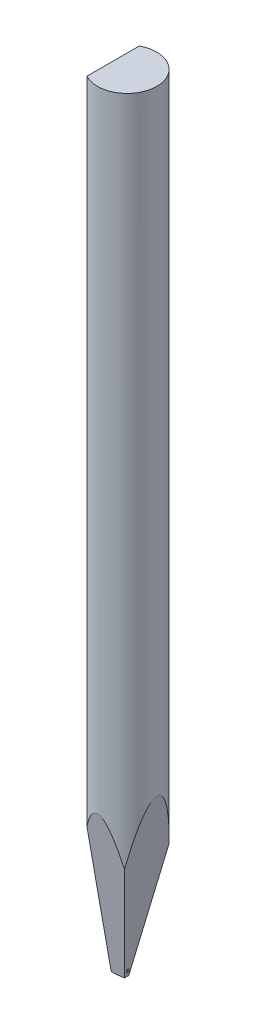
ISO-10303-21;
HEADER;
FILE_DESCRIPTION(('STEP AP214'),'2;1');
FILE_NAME('part.step','',(''),(''),'','','');
FILE_SCHEMA(('AUTOMOTIVE_DESIGN { 1 0 10303 214 1 1 1 1 }'));
ENDSEC;
DATA;
#1=APPLICATION_CONTEXT('core data for automotive mechanical design processes');
#2=APPLICATION_PROTOCOL_DEFINITION('international standard','automotive_design',2000,#1);
#3=PRODUCT_CONTEXT('',#1,'mechanical');
#4=PRODUCT('Part','Part','',(#3));
#5=PRODUCT_RELATED_PRODUCT_CATEGORY('part','',(#4));
#6=PRODUCT_DEFINITION_FORMATION('','',#4);
#7=PRODUCT_DEFINITION_CONTEXT('part definition',#1,'design');
#8=PRODUCT_DEFINITION('design','',#6,#7);
#9=PRODUCT_DEFINITION_SHAPE('','',#8);
#10=(LENGTH_UNIT() NAMED_UNIT(*) SI_UNIT(.MILLI.,.METRE.));
#11=(NAMED_UNIT(*) PLANE_ANGLE_UNIT() SI_UNIT($,.RADIAN.));
#12=(NAMED_UNIT(*) SI_UNIT($,.STERADIAN.) SOLID_ANGLE_UNIT());
#13=UNCERTAINTY_MEASURE_WITH_UNIT(LENGTH_MEASURE(1.E-05),#10,'distance_accuracy_value','');
#14=(GEOMETRIC_REPRESENTATION_CONTEXT(3) GLOBAL_UNCERTAINTY_ASSIGNED_CONTEXT((#13)) GLOBAL_UNIT_ASSIGNED_CONTEXT((#10,
#11,#12)) REPRESENTATION_CONTEXT('',''));
#15=CARTESIAN_POINT('',(0.,0.,0.));
#16=DIRECTION('',(0.,0.,1.));
#17=DIRECTION('',(1.,0.,0.));
#18=AXIS2_PLACEMENT_3D('',#15,#16,#17);
#19=CARTESIAN_POINT('',(26.8738719491216,0.,0.0508));
#20=DIRECTION('',(0.,-0.173648177666931,0.984807753012208));
#21=DIRECTION('',(0.,-0.984807753012208,-0.173648177666931));
#22=AXIS2_PLACEMENT_3D('',#19,#20,#21);
#23=PLANE('',#22);
#24=CARTESIAN_POINT('',(-0.35052,0.0254,0.0552787053099968));
#25=DIRECTION('',(0.,-0.173648177666931,0.984807753012208));
#26=DIRECTION('',(0.,-0.984807753012208,-0.173648177666931));
#27=AXIS2_PLACEMENT_3D('',#24,#25,#26);
#28=ELLIPSE('',#27,0.0257918359418979,0.0254);
#29=CARTESIAN_POINT('',(-0.35052,0.,0.0508000000000018));
#30=VERTEX_POINT('',#29);
#31=CARTESIAN_POINT('',(-0.37592,0.0254,0.0552787053099968));
#32=VERTEX_POINT('',#31);
#33=EDGE_CURVE('E204',#30,#32,#28,.F.);
#34=ORIENTED_EDGE('',*,*,#33,.F.);
#35=DIRECTION('',(-1.,0.,0.));
#36=VECTOR('',#35,1.);
#37=CARTESIAN_POINT('',(26.8738719491216,0.,0.0508));
#38=LINE('',#37,#36);
#39=CARTESIAN_POINT('',(-0.261619999999994,0.,0.0508000000000001));
#40=VERTEX_POINT('',#39);
#41=EDGE_CURVE('E268',#40,#30,#38,.T.);
#42=ORIENTED_EDGE('',*,*,#41,.F.);
#43=DIRECTION('',(-0.98997002855162,-0.139131214142995,-0.0245325869121374));
#44=VECTOR('',#43,1.);
#45=CARTESIAN_POINT('',(26.332265369517,3.73752684781165,0.709826824391458));
#46=LINE('',#45,#44);
#47=CARTESIAN_POINT('',(-0.0141883616704936,0.0347742489826101,0.0569316383295083));
#48=VERTEX_POINT('',#47);
#49=EDGE_CURVE('E265',#48,#40,#46,.T.);
#50=ORIENTED_EDGE('',*,*,#49,.F.);
#51=DIRECTION('',(-0.171087869746036,-0.970287525247814,-0.171087869746036));
#52=VECTOR('',#51,1.);
#53=CARTESIAN_POINT('',(0.766901483986011,4.46455489014234,0.838021483986016));
#54=LINE('',#53,#52);
#55=CARTESIAN_POINT('',(0.523678555180163,3.08516911589156,0.594798555180167));
#56=VERTEX_POINT('',#55);
#57=EDGE_CURVE('E262',#56,#48,#54,.T.);
#58=ORIENTED_EDGE('',*,*,#57,.F.);
#59=CARTESIAN_POINT('',(0.,-0.288101116436578,0.));
#60=DIRECTION('',(0.,-0.173648177666931,0.984807753012208));
#61=DIRECTION('',(0.,-0.984807753012208,-0.173648177666931));
#62=AXIS2_PLACEMENT_3D('',#59,#60,#61);
#63=ELLIPSE('',#62,4.56371043248163,0.792479999999998);
#64=CARTESIAN_POINT('',(-0.37592,3.66844093071415,0.69764511322018));
#65=VERTEX_POINT('',#64);
#66=EDGE_CURVE('E273',#56,#65,#63,.T.);
#67=ORIENTED_EDGE('',*,*,#66,.T.);
#68=DIRECTION('',(0.,0.984807753012208,0.173648177666931));
#69=VECTOR('',#68,1.);
#70=CARTESIAN_POINT('',(-0.37592,20.251112252608,3.62161747949059));
#71=LINE('',#70,#69);
#72=EDGE_CURVE('E287',#32,#65,#71,.T.);
#73=ORIENTED_EDGE('',*,*,#72,.F.);
#74=EDGE_LOOP('',(#34,#42,#50,#58,#67,#73));
#75=FACE_BOUND('',#74,.T.);
#76=ADVANCED_FACE('F46',(#75),#23,.T.);
#77=CARTESIAN_POINT('',(26.8738719491216,0.,-0.0508));
#78=DIRECTION('',(0.,-0.173648177666931,-0.984807753012208));
#79=DIRECTION('',(0.,0.984807753012208,-0.173648177666931));
#80=AXIS2_PLACEMENT_3D('',#77,#78,#79);
#81=PLANE('',#80);
#82=CARTESIAN_POINT('',(-0.35052,0.0254,-0.0552787053099968));
#83=DIRECTION('',(0.,-0.173648177666931,-0.984807753012208));
#84=DIRECTION('',(0.,0.984807753012208,-0.173648177666931));
#85=AXIS2_PLACEMENT_3D('',#82,#83,#84);
#86=ELLIPSE('',#85,0.0257918359418979,0.0254);
#87=CARTESIAN_POINT('',(-0.37592,0.0254,-0.0552787053099968));
#88=VERTEX_POINT('',#87);
#89=CARTESIAN_POINT('',(-0.35052,0.,-0.0508000000000018));
#90=VERTEX_POINT('',#89);
#91=EDGE_CURVE('E201',#88,#90,#86,.F.);
#92=ORIENTED_EDGE('',*,*,#91,.F.);
#93=DIRECTION('',(0.,-0.984807753012208,0.173648177666931));
#94=VECTOR('',#93,1.);
#95=CARTESIAN_POINT('',(-0.37592,20.5255765703836,-3.67001294395617));
#96=LINE('',#95,#94);
#97=CARTESIAN_POINT('',(-0.37592,3.66844093071414,-0.69764511322018));
#98=VERTEX_POINT('',#97);
#99=EDGE_CURVE('E193',#98,#88,#96,.T.);
#100=ORIENTED_EDGE('',*,*,#99,.F.);
#101=CARTESIAN_POINT('',(0.,-0.288101116436578,0.));
#102=DIRECTION('',(0.,-0.173648177666931,-0.984807753012208));
#103=DIRECTION('',(0.,-0.984807753012208,0.173648177666931));
#104=AXIS2_PLACEMENT_3D('',#101,#102,#103);
#105=ELLIPSE('',#104,4.56371043248163,0.792479999999998);
#106=CARTESIAN_POINT('',(0.523678555180163,3.08516911589156,-0.594798555180167));
#107=VERTEX_POINT('',#106);
#108=EDGE_CURVE('E276',#98,#107,#105,.T.);
#109=ORIENTED_EDGE('',*,*,#108,.T.);
#110=DIRECTION('',(0.171087869746036,0.970287525247814,-0.171087869746036));
#111=VECTOR('',#110,1.);
#112=CARTESIAN_POINT('',(0.766901483986011,4.46455489014234,-0.838021483986016));
#113=LINE('',#112,#111);
#114=CARTESIAN_POINT('',(-0.0141883616704936,0.0347742489826101,-0.0569316383295083));
#115=VERTEX_POINT('',#114);
#116=EDGE_CURVE('E290',#115,#107,#113,.T.);
#117=ORIENTED_EDGE('',*,*,#116,.F.);
#118=DIRECTION('',(0.98997002855162,0.139131214142995,-0.0245325869121374));
#119=VECTOR('',#118,1.);
#120=CARTESIAN_POINT('',(26.332265369517,3.73752684781165,-0.709826824391458));
#121=LINE('',#120,#119);
#122=CARTESIAN_POINT('',(-0.261619999999994,0.,-0.0508000000000001));
#123=VERTEX_POINT('',#122);
#124=EDGE_CURVE('E293',#123,#115,#121,.T.);
#125=ORIENTED_EDGE('',*,*,#124,.F.);
#126=DIRECTION('',(-1.,0.,0.));
#127=VECTOR('',#126,1.);
#128=CARTESIAN_POINT('',(26.8738719491216,0.,-0.0508));
#129=LINE('',#128,#127);
#130=EDGE_CURVE('E270',#123,#90,#129,.T.);
#131=ORIENTED_EDGE('',*,*,#130,.T.);
#132=EDGE_LOOP('',(#92,#100,#109,#117,#125,#131));
#133=FACE_BOUND('',#132,.T.);
#134=ADVANCED_FACE('F382',(#133),#81,.T.);
#135=CARTESIAN_POINT('',(-0.26162,0.,27.2760283406468));
#136=DIRECTION('',(-0.139173100960066,0.99026806874157,0.));
#137=DIRECTION('',(-0.99026806874157,-0.139173100960066,0.));
#138=AXIS2_PLACEMENT_3D('',#135,#136,#137);
#139=PLANE('',#138);
#140=DIRECTION('',(-0.99026806874157,-0.139173100960066,0.));
#141=VECTOR('',#140,1.);
#142=CARTESIAN_POINT('',(-0.26162,0.,0.0266699999999995));
#143=LINE('',#142,#141);
#144=CARTESIAN_POINT('',(-0.14478,0.0164207911266275,0.0266699999999997));
#145=VERTEX_POINT('',#144);
#146=CARTESIAN_POINT('',(-0.242759688637711,0.00265064390160265,0.02667));
#147=VERTEX_POINT('',#146);
#148=EDGE_CURVE('E248',#145,#147,#143,.T.);
#149=ORIENTED_EDGE('',*,*,#148,.F.);
#150=DIRECTION('',(0.,0.,1.));
#151=VECTOR('',#150,1.);
#152=CARTESIAN_POINT('',(-0.14478,0.0164207911266275,27.2760283406468));
#153=LINE('',#152,#151);
#154=CARTESIAN_POINT('',(-0.14478,0.0164207911266275,-0.0266699999999997));
#155=VERTEX_POINT('',#154);
#156=EDGE_CURVE('E304',#155,#145,#153,.T.);
#157=ORIENTED_EDGE('',*,*,#156,.F.);
#158=DIRECTION('',(-0.99026806874157,-0.139173100960066,0.));
#159=VECTOR('',#158,1.);
#160=CARTESIAN_POINT('',(-0.26162,0.,-0.0266699999999995));
#161=LINE('',#160,#159);
#162=CARTESIAN_POINT('',(-0.242759688637711,0.00265064390160265,-0.02667));
#163=VERTEX_POINT('',#162);
#164=EDGE_CURVE('E244',#155,#163,#161,.T.);
#165=ORIENTED_EDGE('',*,*,#164,.T.);
#166=CARTESIAN_POINT('',(-2.42134817183527,-0.30353,0.));
#167=DIRECTION('',(-0.139173100960066,0.99026806874157,0.));
#168=DIRECTION('',(-0.99026806874157,-0.139173100960066,0.));
#169=AXIS2_PLACEMENT_3D('',#166,#167,#168);
#170=ELLIPSE('',#169,2.20832903686027,0.30734);
#171=CARTESIAN_POINT('',(-0.26162,0.,-0.0482432865795794));
#172=VERTEX_POINT('',#171);
#173=EDGE_CURVE('E296',#163,#172,#170,.T.);
#174=ORIENTED_EDGE('',*,*,#173,.T.);
#175=DIRECTION('',(0.,0.,-1.));
#176=VECTOR('',#175,1.);
#177=CARTESIAN_POINT('',(-0.26162,0.,27.2760283406468));
#178=LINE('',#177,#176);
#179=EDGE_CURVE('E254',#172,#123,#178,.T.);
#180=ORIENTED_EDGE('',*,*,#179,.T.);
#181=ORIENTED_EDGE('',*,*,#124,.T.);
#182=DIRECTION('',(0.,0.,-1.));
#183=VECTOR('',#182,1.);
#184=CARTESIAN_POINT('',(-0.0141883616704921,0.0347742489826094,27.2760283406468));
#185=LINE('',#184,#183);
#186=EDGE_CURVE('E251',#48,#115,#185,.T.);
#187=ORIENTED_EDGE('',*,*,#186,.F.);
#188=ORIENTED_EDGE('',*,*,#49,.T.);
#189=CARTESIAN_POINT('',(-0.261619999999997,0.,0.0482432865795852));
#190=VERTEX_POINT('',#189);
#191=EDGE_CURVE('E256',#40,#190,#178,.T.);
#192=ORIENTED_EDGE('',*,*,#191,.T.);
#193=EDGE_CURVE('E297',#190,#147,#170,.T.);
#194=ORIENTED_EDGE('',*,*,#193,.T.);
#195=EDGE_LOOP('',(#149,#157,#165,#174,#180,#181,#187,#188,#192,#194));
#196=FACE_BOUND('',#195,.T.);
#197=ADVANCED_FACE('F329',(#196),#139,.F.);
#198=CARTESIAN_POINT('',(26.7309969491216,-0.30353,0.));
#199=DIRECTION('',(-1.,0.,0.));
#200=DIRECTION('',(0.,0.,1.));
#201=AXIS2_PLACEMENT_3D('',#198,#199,#200);
#202=CYLINDRICAL_SURFACE('',#201,0.30734);
#203=DIRECTION('',(-1.,0.,0.));
#204=VECTOR('',#203,1.);
#205=CARTESIAN_POINT('',(26.7309969491216,0.,0.0482432865795852));
#206=LINE('',#205,#204);
#207=CARTESIAN_POINT('',(-0.35052,0.,0.0482432865795858));
#208=VERTEX_POINT('',#207);
#209=EDGE_CURVE('E303',#190,#208,#206,.T.);
#210=ORIENTED_EDGE('',*,*,#209,.T.);
#211=CARTESIAN_POINT('',(-0.35052,0.,0.0482432865795852));
#212=CARTESIAN_POINT('',(-0.350767913301096,-1.19542843772803E-07,0.0482439866555444));
#213=CARTESIAN_POINT('',(-0.351014861392933,3.62470794984307E-06,0.0482204837583812));
#214=CARTESIAN_POINT('',(-0.351497824475882,1.77257610530701E-05,0.048131663550789));
#215=CARTESIAN_POINT('',(-0.351733938449228,2.79980345508259E-05,0.0480668807295799));
#216=CARTESIAN_POINT('',(-0.352256326088675,5.77005969758154E-05,0.0478789541586123));
#217=CARTESIAN_POINT('',(-0.352538394385228,7.88787351782238E-05,0.0477446199469163));
#218=CARTESIAN_POINT('',(-0.353078295346921,0.000127703558985932,0.0474331108524059));
#219=CARTESIAN_POINT('',(-0.353335984553503,0.000155385552449527,0.0472557019452807));
#220=CARTESIAN_POINT('',(-0.35400174233734,0.00023617459435752,0.0467343071530912));
#221=CARTESIAN_POINT('',(-0.354386489991853,0.000293366747035686,0.04636155839518));
#222=CARTESIAN_POINT('',(-0.355098951579075,0.000413574680164901,0.0455669319559007));
#223=CARTESIAN_POINT('',(-0.355426537167256,0.000476603091413842,0.0451449471799639));
#224=CARTESIAN_POINT('',(-0.356612086855196,0.000724574718518854,0.0434579803018295));
#225=CARTESIAN_POINT('',(-0.357318341338528,0.000917424822642028,0.0420900984298448));
#226=CARTESIAN_POINT('',(-0.358546499103955,0.00129385703696121,0.0392733364497388));
#227=CARTESIAN_POINT('',(-0.359067131306756,0.0014773681362723,0.0378239736931028));
#228=CARTESIAN_POINT('',(-0.361082963556255,0.00223677886764504,0.0314441024489423));
#229=CARTESIAN_POINT('',(-0.361998491462294,0.00272303861932352,0.0263250556700738));
#230=CARTESIAN_POINT('',(-0.363287466260708,0.00343648568054079,0.0160225561821279));
#231=CARTESIAN_POINT('',(-0.363659578270333,0.0036630347273081,0.0108389763129056));
#232=CARTESIAN_POINT('',(-0.363972985043323,0.00385330138614358,0.000449493392470492));
#233=CARTESIAN_POINT('',(-0.363914353724792,0.00381706409391508,-0.00475640567539981));
#234=CARTESIAN_POINT('',(-0.363359645903479,0.00348101396992523,-0.0151346555748545));
#235=CARTESIAN_POINT('',(-0.362863906204434,0.00318140407436096,-0.0203070291482792));
#236=CARTESIAN_POINT('',(-0.361587863461915,0.00253284401461739,-0.0281196828661227));
#237=CARTESIAN_POINT('',(-0.361052170464876,0.0022738659867185,-0.0308032472057407));
#238=CARTESIAN_POINT('',(-0.359879874536839,0.00178202258087802,-0.0352985409759539));
#239=CARTESIAN_POINT('',(-0.359320212463211,0.00156415994286779,-0.0371329765625637));
#240=CARTESIAN_POINT('',(-0.357915449615104,0.00108653420359569,-0.0408693960879428));
#241=CARTESIAN_POINT('',(-0.3570519058511,0.000824845821217691,-0.0427659366927652));
#242=CARTESIAN_POINT('',(-0.355666955135482,0.000526022910364276,-0.0448100132221557));
#243=CARTESIAN_POINT('',(-0.355427139387419,0.000477218188454204,-0.0451397061499097));
#244=CARTESIAN_POINT('',(-0.354916645564511,0.00038202095342617,-0.0457761949331125));
#245=CARTESIAN_POINT('',(-0.354645904201855,0.000335633680386315,-0.046082941629228));
#246=CARTESIAN_POINT('',(-0.354064289185953,0.000246758191854156,-0.046665244521223));
#247=CARTESIAN_POINT('',(-0.353752942125983,0.000204328109509145,-0.0469403464238046));
#248=CARTESIAN_POINT('',(-0.353086480397482,0.000127793869631165,-0.0474329155161114));
#249=CARTESIAN_POINT('',(-0.352731561443898,9.36543940562352E-05,-0.0476506275388426));
#250=CARTESIAN_POINT('',(-0.352132978988963,5.02841505678784E-05,-0.0479259603811109));
#251=CARTESIAN_POINT('',(-0.351903112512649,3.65754200289388E-05,-0.0480126464944021));
#252=CARTESIAN_POINT('',(-0.351432234922708,1.53075235908591E-05,-0.0481469291864184));
#253=CARTESIAN_POINT('',(-0.351191258260106,7.73054276230474E-06,-0.0481946390090931));
#254=CARTESIAN_POINT('',(-0.350805892270728,1.19685939597785E-06,-0.0482357533750439));
#255=CARTESIAN_POINT('',(-0.350662956582406,-3.31045745205668E-08,-0.0482434827775498));
#256=CARTESIAN_POINT('',(-0.35052,0.,-0.0482432865795856));
#257=B_SPLINE_CURVE_WITH_KNOTS('',3,(#211,#212,#213,#214,#215,#216,#217,#218,#219,#220,#221,
#222,#223,#224,#225,#226,#227,#228,#229,#230,#231,#232,#233,#234,#235,#236,#237,#238,#239,#240,
#241,#242,#243,#244,#245,#246,#247,#248,#249,#250,#251,#252,#253,#254,#255,#256),.UNSPECIFIED.,
.F.,.F.,(4,2,2,2,2,2,2,2,2,2,2,2,2,2,2,2,2,2,2,2,2,2,4),(0.,0.000741043318305486,
0.00147268140779397,0.00240682725086805,0.00334616655924916,0.00495326023235424,
0.00656391709747215,0.0111818210055972,0.0158307654682357,0.0313880221471822,0.0469834307890158,
0.0625761632290354,0.0781568915394422,0.0863865542979192,0.0921775559520869,0.0984081610414817,
0.0996385359491797,0.100871475463076,0.102120347956776,0.103363803055068,0.104099176293444,
0.104832405260387,0.105261095012052),.UNSPECIFIED.);
#258=CARTESIAN_POINT('',(-0.361394986445845,0.00245148621527582,0.028861259944239));
#259=VERTEX_POINT('',#258);
#260=EDGE_CURVE('E202',#208,#259,#257,.T.);
#261=ORIENTED_EDGE('',*,*,#260,.T.);
#262=CARTESIAN_POINT('',(-0.37592,0.,-0.0482432865795854));
#263=CARTESIAN_POINT('',(-0.363217772431748,0.00253447256157342,-0.0322972656685655));
#264=CARTESIAN_POINT('',(-0.35052,0.00380999999999999,-0.0161478491107738));
#265=CARTESIAN_POINT('',(-0.35052,0.00380999999999997,0.0161478491107741));
#266=CARTESIAN_POINT('',(-0.363217772431748,0.00253447256157349,0.0322972656685651));
#267=CARTESIAN_POINT('',(-0.37592,0.,0.0482432865795852));
#268=(BOUNDED_CURVE() B_SPLINE_CURVE(3,(#262,#263,#264,#265,#266,#267),.UNSPECIFIED.,.F.,
.F.) B_SPLINE_CURVE_WITH_KNOTS((4,2,4),(1.41317404265068,1.5707963267949,1.72841861093912),
.UNSPECIFIED.) CURVE() GEOMETRIC_REPRESENTATION_ITEM() RATIONAL_B_SPLINE_CURVE((1.,1.,1.,1.,1.,1.)) REPRESENTATION_ITEM(''));
#269=CARTESIAN_POINT('',(-0.36139493561956,0.00245148328491575,-0.0288612910505755));
#270=VERTEX_POINT('',#269);
#271=EDGE_CURVE('E185',#259,#270,#268,.F.);
#272=ORIENTED_EDGE('',*,*,#271,.T.);
#273=CARTESIAN_POINT('',(-0.35052,0.,-0.0482432865795858));
#274=VERTEX_POINT('',#273);
#275=EDGE_CURVE('E79',#270,#274,#257,.T.);
#276=ORIENTED_EDGE('',*,*,#275,.T.);
#277=DIRECTION('',(-1.,0.,0.));
#278=VECTOR('',#277,1.);
#279=CARTESIAN_POINT('',(26.7309969491216,0.,-0.0482432865795852));
#280=LINE('',#279,#278);
#281=EDGE_CURVE('E255',#172,#274,#280,.T.);
#282=ORIENTED_EDGE('',*,*,#281,.F.);
#283=ORIENTED_EDGE('',*,*,#173,.F.);
#284=DIRECTION('',(-1.,0.,0.));
#285=VECTOR('',#284,1.);
#286=CARTESIAN_POINT('',(26.7309969491216,0.00265064390160265,-0.02667));
#287=LINE('',#286,#285);
#288=CARTESIAN_POINT('',(-0.271948138549541,0.00265064390160211,-0.02667));
#289=VERTEX_POINT('',#288);
#290=EDGE_CURVE('E300',#163,#289,#287,.T.);
#291=ORIENTED_EDGE('',*,*,#290,.T.);
#292=CARTESIAN_POINT('',(-0.271948138551085,0.0026506439016026,0.02667));
#293=CARTESIAN_POINT('',(-0.279741629783165,0.00204900725860289,0.033576992678982));
#294=CARTESIAN_POINT('',(-0.291389606178554,0.00193660172033543,0.034257483360682));
#295=CARTESIAN_POINT('',(-0.311487532290503,0.00289784041037014,0.0241950109364427));
#296=CARTESIAN_POINT('',(-0.319710546582025,0.00381613135063559,0.0123603930079638));
#297=CARTESIAN_POINT('',(-0.319620360481282,0.003803793942765,-0.012663446302628));
#298=CARTESIAN_POINT('',(-0.311402735354475,0.00288674413616352,-0.0243323793322763));
#299=CARTESIAN_POINT('',(-0.291204635526973,0.0019239672897776,-0.0343680031120969));
#300=CARTESIAN_POINT('',(-0.279697672011876,0.00205131867932823,-0.0335504567852432));
#301=CARTESIAN_POINT('',(-0.271948138549539,0.00265064390160259,-0.02667));
#302=(BOUNDED_CURVE() B_SPLINE_CURVE(3,(#292,#293,#294,#295,#296,#297,#298,#299,#300,#301),
.UNSPECIFIED.,.F.,.F.) B_SPLINE_CURVE_WITH_KNOTS((4,2,2,2,4),(0.,2.31400024965948E-05,
4.62800049931879E-05,6.9420007489781E-05,9.25600099863741E-05),
.UNSPECIFIED.) CURVE() GEOMETRIC_REPRESENTATION_ITEM() RATIONAL_B_SPLINE_CURVE((1.,1.,1.,1.,1.,
1.,1.,1.,1.,1.)) REPRESENTATION_ITEM(''));
#303=CARTESIAN_POINT('',(-0.271948138549541,0.00265064390160196,0.02667));
#304=VERTEX_POINT('',#303);
#305=EDGE_CURVE('E306',#289,#304,#302,.F.);
#306=ORIENTED_EDGE('',*,*,#305,.T.);
#307=DIRECTION('',(-1.,0.,0.));
#308=VECTOR('',#307,1.);
#309=CARTESIAN_POINT('',(26.7309969491216,0.00265064390160265,0.02667));
#310=LINE('',#309,#308);
#311=EDGE_CURVE('E307',#147,#304,#310,.T.);
#312=ORIENTED_EDGE('',*,*,#311,.F.);
#313=ORIENTED_EDGE('',*,*,#193,.F.);
#314=EDGE_LOOP('',(#210,#261,#272,#276,#282,#283,#291,#306,#312,#313));
#315=FACE_BOUND('',#314,.T.);
#316=ADVANCED_FACE('F318',(#315),#202,.F.);
#317=CARTESIAN_POINT('',(0.,0.,0.));
#318=DIRECTION('',(0.,1.,0.));
#319=DIRECTION('',(0.,0.,1.));
#320=AXIS2_PLACEMENT_3D('',#317,#318,#319);
#321=PLANE('',#320);
#322=ORIENTED_EDGE('',*,*,#41,.T.);
#323=DIRECTION('',(0.,0.,-1.));
#324=VECTOR('',#323,1.);
#325=CARTESIAN_POINT('',(-0.35052,0.,26.4440181042188));
#326=LINE('',#325,#324);
#327=EDGE_CURVE('E71',#30,#208,#326,.T.);
#328=ORIENTED_EDGE('',*,*,#327,.T.);
#329=ORIENTED_EDGE('',*,*,#209,.F.);
#330=ORIENTED_EDGE('',*,*,#191,.F.);
#331=EDGE_LOOP('',(#322,#328,#329,#330));
#332=FACE_BOUND('',#331,.T.);
#333=ADVANCED_FACE('F328',(#332),#321,.F.);
#334=ORIENTED_EDGE('',*,*,#281,.T.);
#335=EDGE_CURVE('E200',#274,#90,#326,.T.);
#336=ORIENTED_EDGE('',*,*,#335,.T.);
#337=ORIENTED_EDGE('',*,*,#130,.F.);
#338=ORIENTED_EDGE('',*,*,#179,.F.);
#339=EDGE_LOOP('',(#334,#336,#337,#338));
#340=FACE_BOUND('',#339,.T.);
#341=ADVANCED_FACE('F387',(#340),#321,.F.);
#342=CARTESIAN_POINT('',(0.,21.0312,0.));
#343=DIRECTION('',(0.,-1.,0.));
#344=DIRECTION('',(0.,0.,-1.));
#345=AXIS2_PLACEMENT_3D('',#342,#343,#344);
#346=CYLINDRICAL_SURFACE('',#345,0.792479999999998);
#347=ORIENTED_EDGE('',*,*,#66,.F.);
#348=CARTESIAN_POINT('',(0.,0.115240446574634,0.));
#349=DIRECTION('',(-0.984807753012208,0.173648177666931,0.));
#350=DIRECTION('',(-0.173648177666931,-0.984807753012208,0.));
#351=AXIS2_PLACEMENT_3D('',#348,#349,#350);
#352=ELLIPSE('',#351,4.56371043248165,0.792479999999998);
#353=EDGE_CURVE('E259',#56,#107,#352,.T.);
#354=ORIENTED_EDGE('',*,*,#353,.T.);
#355=ORIENTED_EDGE('',*,*,#108,.F.);
#356=DIRECTION('',(0.,-1.,0.));
#357=VECTOR('',#356,1.);
#358=CARTESIAN_POINT('',(-0.37592,21.0312,-0.69764511322018));
#359=LINE('',#358,#357);
#360=CARTESIAN_POINT('',(-0.37592,21.0312,-0.69764511322018));
#361=VERTEX_POINT('',#360);
#362=EDGE_CURVE('E282',#361,#98,#359,.T.);
#363=ORIENTED_EDGE('',*,*,#362,.F.);
#364=CARTESIAN_POINT('',(0.,21.0312,0.));
#365=DIRECTION('',(0.,1.,0.));
#366=DIRECTION('',(0.,0.,1.));
#367=AXIS2_PLACEMENT_3D('',#364,#365,#366);
#368=CIRCLE('',#367,0.792479999999998);
#369=CARTESIAN_POINT('',(-0.37592,21.0312,0.69764511322018));
#370=VERTEX_POINT('',#369);
#371=EDGE_CURVE('E284',#370,#361,#368,.T.);
#372=ORIENTED_EDGE('',*,*,#371,.F.);
#373=DIRECTION('',(0.,-1.,0.));
#374=VECTOR('',#373,1.);
#375=CARTESIAN_POINT('',(-0.37592,21.0312,0.69764511322018));
#376=LINE('',#375,#374);
#377=EDGE_CURVE('E280',#65,#370,#376,.F.);
#378=ORIENTED_EDGE('',*,*,#377,.F.);
#379=EDGE_LOOP('',(#347,#354,#355,#363,#372,#378));
#380=FACE_BOUND('',#379,.T.);
#381=ADVANCED_FACE('F381',(#380),#346,.T.);
#382=CARTESIAN_POINT('',(-0.37592,21.0312,-0.80247998));
#383=DIRECTION('',(-1.,0.,0.));
#384=DIRECTION('',(0.,0.,1.));
#385=AXIS2_PLACEMENT_3D('',#382,#383,#384);
#386=PLANE('',#385);
#387=DIRECTION('',(0.,0.,-1.));
#388=VECTOR('',#387,1.);
#389=CARTESIAN_POINT('',(-0.37592,0.0254,26.4440181042188));
#390=LINE('',#389,#388);
#391=CARTESIAN_POINT('',(-0.37592,0.0253965728299479,0.0162828578856257));
#392=VERTEX_POINT('',#391);
#393=EDGE_CURVE('E196',#32,#392,#390,.T.);
#394=ORIENTED_EDGE('',*,*,#393,.F.);
#395=ORIENTED_EDGE('',*,*,#72,.T.);
#396=ORIENTED_EDGE('',*,*,#377,.T.);
#397=DIRECTION('',(0.,0.,-1.));
#398=VECTOR('',#397,1.);
#399=CARTESIAN_POINT('',(-0.37592,21.0312,-0.80247998));
#400=LINE('',#399,#398);
#401=EDGE_CURVE('E278',#370,#361,#400,.T.);
#402=ORIENTED_EDGE('',*,*,#401,.T.);
#403=ORIENTED_EDGE('',*,*,#362,.T.);
#404=ORIENTED_EDGE('',*,*,#99,.T.);
#405=CARTESIAN_POINT('',(-0.37592,0.0254,-0.0160570095759892));
#406=VERTEX_POINT('',#405);
#407=EDGE_CURVE('E190',#406,#88,#390,.T.);
#408=ORIENTED_EDGE('',*,*,#407,.F.);
#409=CARTESIAN_POINT('',(-0.37592,0.,0.0482432865795852));
#410=CARTESIAN_POINT('',(-0.37592,0.0149574693246277,0.0344039161936227));
#411=CARTESIAN_POINT('',(-0.37592,0.0292099999999983,0.0174815349681417));
#412=CARTESIAN_POINT('',(-0.37592,0.0292099999999983,-0.0174815349681413));
#413=CARTESIAN_POINT('',(-0.37592,0.0149574693246281,-0.0344039161936234));
#414=CARTESIAN_POINT('',(-0.37592,0.,-0.0482432865795854));
#415=(BOUNDED_CURVE() B_SPLINE_CURVE(3,(#409,#410,#411,#412,#413,#414),.UNSPECIFIED.,.F.,
.F.) B_SPLINE_CURVE_WITH_KNOTS((4,2,4),(1.41317404265068,1.5707963267949,1.72841861093912),
.UNSPECIFIED.) CURVE() GEOMETRIC_REPRESENTATION_ITEM() RATIONAL_B_SPLINE_CURVE((1.,1.,1.,1.,1.,1.)) REPRESENTATION_ITEM(''));
#416=EDGE_CURVE('E178',#406,#392,#415,.F.);
#417=ORIENTED_EDGE('',*,*,#416,.T.);
#418=EDGE_LOOP('',(#394,#395,#396,#402,#403,#404,#408,#417));
#419=FACE_BOUND('',#418,.T.);
#420=ADVANCED_FACE('F191',(#419),#386,.T.);
#421=CARTESIAN_POINT('',(0.,21.0312,0.));
#422=DIRECTION('',(0.,1.,0.));
#423=DIRECTION('',(0.,0.,1.));
#424=AXIS2_PLACEMENT_3D('',#421,#422,#423);
#425=PLANE('',#424);
#426=ORIENTED_EDGE('',*,*,#371,.T.);
#427=ORIENTED_EDGE('',*,*,#401,.F.);
#428=EDGE_LOOP('',(#426,#427));
#429=FACE_BOUND('',#428,.T.);
#430=ADVANCED_FACE('F380',(#429),#425,.T.);
#431=CARTESIAN_POINT('',(-0.0141883616704921,0.0347742489826094,27.2760283406468));
#432=DIRECTION('',(-0.984807753012208,0.173648177666931,0.));
#433=DIRECTION('',(-0.173648177666931,-0.984807753012208,0.));
#434=AXIS2_PLACEMENT_3D('',#431,#432,#433);
#435=PLANE('',#434);
#436=CARTESIAN_POINT('',(0.0118580494727311,0.182490786965459,0.));
#437=DIRECTION('',(-0.984807753012208,0.173648177666931,0.));
#438=DIRECTION('',(0.173648177666931,0.984807753012208,0.));
#439=AXIS2_PLACEMENT_3D('',#436,#437,#438);
#440=ELLIPSE('',#439,0.0515734368592615,0.0370444608655554);
#441=CARTESIAN_POINT('',(0.0208136827993624,0.233280707433946,0.));
#442=VERTEX_POINT('',#441);
#443=EDGE_CURVE('E250',#442,#442,#440,.F.);
#444=ORIENTED_EDGE('',*,*,#443,.F.);
#445=EDGE_LOOP('',(#444));
#446=FACE_BOUND('',#445,.T.);
#447=ORIENTED_EDGE('',*,*,#353,.F.);
#448=ORIENTED_EDGE('',*,*,#57,.T.);
#449=ORIENTED_EDGE('',*,*,#186,.T.);
#450=ORIENTED_EDGE('',*,*,#116,.T.);
#451=EDGE_LOOP('',(#447,#448,#449,#450));
#452=FACE_BOUND('',#451,.T.);
#453=ADVANCED_FACE('F334',(#446,#452),#435,.F.);
#454=CARTESIAN_POINT('',(-0.14478,0.0762000000000001,0.02667));
#455=DIRECTION('',(-1.,0.,0.));
#456=DIRECTION('',(0.,0.,1.));
#457=AXIS2_PLACEMENT_3D('',#454,#455,#456);
#458=PLANE('',#457);
#459=ORIENTED_EDGE('',*,*,#156,.T.);
#460=DIRECTION('',(0.,1.,0.));
#461=VECTOR('',#460,1.);
#462=CARTESIAN_POINT('',(-0.14478,0.0762000000000001,0.02667));
#463=LINE('',#462,#461);
#464=CARTESIAN_POINT('',(-0.14478,0.0762000000000001,0.02667));
#465=VERTEX_POINT('',#464);
#466=EDGE_CURVE('E231',#145,#465,#463,.T.);
#467=ORIENTED_EDGE('',*,*,#466,.T.);
#468=DIRECTION('',(0.,0.,-1.));
#469=VECTOR('',#468,1.);
#470=CARTESIAN_POINT('',(-0.14478,0.0762000000000001,0.02667));
#471=LINE('',#470,#469);
#472=CARTESIAN_POINT('',(-0.14478,0.0762000000000001,0.02286));
#473=VERTEX_POINT('',#472);
#474=EDGE_CURVE('E238',#465,#473,#471,.T.);
#475=ORIENTED_EDGE('',*,*,#474,.T.);
#476=CARTESIAN_POINT('',(-0.14478,0.0762,0.));
#477=DIRECTION('',(1.,0.,0.));
#478=DIRECTION('',(0.,1.,0.));
#479=AXIS2_PLACEMENT_3D('',#476,#477,#478);
#480=ELLIPSE('',#479,0.0263964543073496,0.02286);
#481=CARTESIAN_POINT('',(-0.14478,0.0762000000000001,-0.0228599999999995));
#482=VERTEX_POINT('',#481);
#483=EDGE_CURVE('E224',#482,#473,#480,.F.);
#484=ORIENTED_EDGE('',*,*,#483,.F.);
#485=CARTESIAN_POINT('',(-0.14478,0.0762000000000001,-0.02667));
#486=VERTEX_POINT('',#485);
#487=EDGE_CURVE('E234',#482,#486,#471,.T.);
#488=ORIENTED_EDGE('',*,*,#487,.T.);
#489=DIRECTION('',(0.,1.,0.));
#490=VECTOR('',#489,1.);
#491=CARTESIAN_POINT('',(-0.14478,0.0762000000000001,-0.02667));
#492=LINE('',#491,#490);
#493=EDGE_CURVE('E232',#155,#486,#492,.T.);
#494=ORIENTED_EDGE('',*,*,#493,.F.);
#495=EDGE_LOOP('',(#459,#467,#475,#484,#488,#494));
#496=FACE_BOUND('',#495,.T.);
#497=ADVANCED_FACE('F493',(#496),#458,.T.);
#498=CARTESIAN_POINT('',(-0.0160823936975685,0.150503597642768,0.));
#499=DIRECTION('',(0.866025403784441,0.499999999999995,0.));
#500=DIRECTION('',(-0.499999999999995,0.866025403784441,0.));
#501=AXIS2_PLACEMENT_3D('',#498,#499,#500);
#502=CONICAL_SURFACE('',#501,0.02286,0.392699081698725);
#503=CARTESIAN_POINT('',(-0.0160823936975685,0.150503597642768,0.));
#504=DIRECTION('',(0.866025403784441,0.499999999999995,0.));
#505=DIRECTION('',(-0.499999999999995,0.866025403784441,0.));
#506=AXIS2_PLACEMENT_3D('',#503,#504,#505);
#507=CIRCLE('',#506,0.02286);
#508=CARTESIAN_POINT('',(-0.0275123936975684,0.170300938373281,0.));
#509=VERTEX_POINT('',#508);
#510=EDGE_CURVE('E218',#509,#509,#507,.T.);
#511=ORIENTED_EDGE('',*,*,#510,.F.);
#512=EDGE_LOOP('',(#511));
#513=FACE_BOUND('',#512,.T.);
#514=ORIENTED_EDGE('',*,*,#443,.T.);
#515=EDGE_LOOP('',(#514));
#516=FACE_BOUND('',#515,.T.);
#517=ADVANCED_FACE('F498',(#513,#516),#502,.F.);
#518=CARTESIAN_POINT('',(-0.21652472337914,0.0762000000000001,0.));
#519=DIRECTION('',(-0.601815023152052,-0.79863551004729,0.));
#520=DIRECTION('',(0.79863551004729,-0.601815023152052,0.));
#521=AXIS2_PLACEMENT_3D('',#518,#519,#520);
#522=CYLINDRICAL_SURFACE('',#521,0.02667);
#523=DIRECTION('',(-0.601815023152052,-0.79863551004729,0.));
#524=VECTOR('',#523,1.);
#525=CARTESIAN_POINT('',(-0.174727583415436,0.131666678147377,0.02667));
#526=LINE('',#525,#524);
#527=CARTESIAN_POINT('',(-0.21652472337914,0.0762000000000001,0.02667));
#528=VERTEX_POINT('',#527);
#529=EDGE_CURVE('E241',#528,#304,#526,.T.);
#530=ORIENTED_EDGE('',*,*,#529,.T.);
#531=CARTESIAN_POINT('',(-0.271948138549539,0.00265064390160259,-0.02667));
#532=CARTESIAN_POINT('',(-0.279555270960462,0.00943805816144823,-0.0266700000000003));
#533=CARTESIAN_POINT('',(-0.284674543491638,0.0121424270676666,-0.0223594763620331));
#534=CARTESIAN_POINT('',(-0.292737360954689,0.0154005961716068,-0.0127540251388889));
#535=CARTESIAN_POINT('',(-0.295295129632121,0.0159528055988088,-0.00649764567299892));
#536=CARTESIAN_POINT('',(-0.295351163487313,0.0159406242705773,0.00634219519512988));
#537=CARTESIAN_POINT('',(-0.292789505622227,0.0153880805572035,0.0126791163867823));
#538=CARTESIAN_POINT('',(-0.284811098085695,0.01211920203898,0.0222861029267893));
#539=CARTESIAN_POINT('',(-0.279588088563957,0.00945438320073146,0.0266699999995283));
#540=CARTESIAN_POINT('',(-0.271948138551085,0.0026506439016026,0.02667));
#541=(BOUNDED_CURVE() B_SPLINE_CURVE(3,(#531,#532,#533,#534,#535,#536,#537,#538,#539,#540),
.UNSPECIFIED.,.F.,.F.) B_SPLINE_CURVE_WITH_KNOTS((4,2,2,2,4),(0.,2.31400024965948E-05,
4.62800049931879E-05,6.9420007489781E-05,9.25600099863741E-05),
.UNSPECIFIED.) CURVE() GEOMETRIC_REPRESENTATION_ITEM() RATIONAL_B_SPLINE_CURVE((1.,1.,1.,1.,1.,
1.,1.,1.,1.,1.)) REPRESENTATION_ITEM(''));
#542=EDGE_CURVE('E440',#304,#289,#541,.F.);
#543=ORIENTED_EDGE('',*,*,#542,.T.);
#544=DIRECTION('',(0.601815023152052,0.79863551004729,0.));
#545=VECTOR('',#544,1.);
#546=CARTESIAN_POINT('',(-0.21652472337914,0.0762000000000001,-0.02667));
#547=LINE('',#546,#545);
#548=CARTESIAN_POINT('',(-0.21652472337914,0.0762000000000001,-0.02667));
#549=VERTEX_POINT('',#548);
#550=EDGE_CURVE('E245',#289,#549,#547,.T.);
#551=ORIENTED_EDGE('',*,*,#550,.T.);
#552=CARTESIAN_POINT('',(-0.21652472337914,0.0762000000000001,0.));
#553=DIRECTION('',(0.,-1.,0.));
#554=DIRECTION('',(-1.,0.,0.));
#555=AXIS2_PLACEMENT_3D('',#552,#553,#554);
#556=ELLIPSE('',#555,0.0333944580030267,0.02667);
#557=EDGE_CURVE('E242',#549,#528,#556,.F.);
#558=ORIENTED_EDGE('',*,*,#557,.T.);
#559=EDGE_LOOP('',(#530,#543,#551,#558));
#560=FACE_BOUND('',#559,.T.);
#561=ADVANCED_FACE('F331',(#560),#522,.F.);
#562=CARTESIAN_POINT('',(0.,0.,0.02667));
#563=DIRECTION('',(0.,0.,-1.));
#564=DIRECTION('',(-1.,0.,0.));
#565=AXIS2_PLACEMENT_3D('',#562,#563,#564);
#566=PLANE('',#565);
#567=ORIENTED_EDGE('',*,*,#148,.T.);
#568=ORIENTED_EDGE('',*,*,#311,.T.);
#569=ORIENTED_EDGE('',*,*,#529,.F.);
#570=DIRECTION('',(-1.,0.,0.));
#571=VECTOR('',#570,1.);
#572=CARTESIAN_POINT('',(-0.249919181382167,0.0762000000000001,0.02667));
#573=LINE('',#572,#571);
#574=EDGE_CURVE('E228',#465,#528,#573,.T.);
#575=ORIENTED_EDGE('',*,*,#574,.F.);
#576=ORIENTED_EDGE('',*,*,#466,.F.);
#577=EDGE_LOOP('',(#567,#568,#569,#575,#576));
#578=FACE_BOUND('',#577,.T.);
#579=ADVANCED_FACE('F462',(#578),#566,.T.);
#580=CARTESIAN_POINT('',(0.,0.,-0.02667));
#581=DIRECTION('',(0.,0.,-1.));
#582=DIRECTION('',(-1.,0.,0.));
#583=AXIS2_PLACEMENT_3D('',#580,#581,#582);
#584=PLANE('',#583);
#585=ORIENTED_EDGE('',*,*,#493,.T.);
#586=DIRECTION('',(-1.,0.,0.));
#587=VECTOR('',#586,1.);
#588=CARTESIAN_POINT('',(-0.249919181382167,0.0762000000000001,-0.02667));
#589=LINE('',#588,#587);
#590=EDGE_CURVE('E227',#486,#549,#589,.T.);
#591=ORIENTED_EDGE('',*,*,#590,.T.);
#592=ORIENTED_EDGE('',*,*,#550,.F.);
#593=ORIENTED_EDGE('',*,*,#290,.F.);
#594=ORIENTED_EDGE('',*,*,#164,.F.);
#595=EDGE_LOOP('',(#585,#591,#592,#593,#594));
#596=FACE_BOUND('',#595,.T.);
#597=ADVANCED_FACE('F449',(#596),#584,.F.);
#598=CARTESIAN_POINT('',(-0.249919181382167,0.0762000000000001,0.02667));
#599=DIRECTION('',(0.,-1.,0.));
#600=DIRECTION('',(1.,0.,0.));
#601=AXIS2_PLACEMENT_3D('',#598,#599,#600);
#602=PLANE('',#601);
#603=ORIENTED_EDGE('',*,*,#590,.F.);
#604=ORIENTED_EDGE('',*,*,#487,.F.);
#605=CARTESIAN_POINT('',(-0.14478,0.0762000000000001,0.));
#606=DIRECTION('',(0.,1.,0.));
#607=DIRECTION('',(1.,0.,0.));
#608=AXIS2_PLACEMENT_3D('',#605,#606,#607);
#609=ELLIPSE('',#608,0.0457200000000005,0.02286);
#610=EDGE_CURVE('E221',#473,#482,#609,.F.);
#611=ORIENTED_EDGE('',*,*,#610,.F.);
#612=ORIENTED_EDGE('',*,*,#474,.F.);
#613=ORIENTED_EDGE('',*,*,#574,.T.);
#614=ORIENTED_EDGE('',*,*,#557,.F.);
#615=EDGE_LOOP('',(#603,#604,#611,#612,#613,#614));
#616=FACE_BOUND('',#615,.T.);
#617=ADVANCED_FACE('F600',(#616),#602,.T.);
#618=CARTESIAN_POINT('',(-0.360755274816786,-0.0484933830537733,0.));
#619=DIRECTION('',(0.866025403784441,0.499999999999995,0.));
#620=DIRECTION('',(-0.499999999999995,0.866025403784441,0.));
#621=AXIS2_PLACEMENT_3D('',#618,#619,#620);
#622=CYLINDRICAL_SURFACE('',#621,0.02286);
#623=ORIENTED_EDGE('',*,*,#483,.T.);
#624=ORIENTED_EDGE('',*,*,#610,.T.);
#625=EDGE_LOOP('',(#623,#624));
#626=FACE_BOUND('',#625,.T.);
#627=ORIENTED_EDGE('',*,*,#510,.T.);
#628=EDGE_LOOP('',(#627));
#629=FACE_BOUND('',#628,.T.);
#630=ADVANCED_FACE('F400',(#626,#629),#622,.F.);
#631=CARTESIAN_POINT('',(-0.271948138549539,0.00265064390160259,-0.02667));
#632=CARTESIAN_POINT('',(-0.279697672011876,0.00205131867932823,-0.0335504567852432));
#633=CARTESIAN_POINT('',(-0.291204635526973,0.0019239672897776,-0.0343680031120969));
#634=CARTESIAN_POINT('',(-0.311402735354475,0.00288674413616352,-0.0243323793322763));
#635=CARTESIAN_POINT('',(-0.319620360481282,0.003803793942765,-0.012663446302628));
#636=CARTESIAN_POINT('',(-0.319710546582025,0.00381613135063559,0.0123603930079638));
#637=CARTESIAN_POINT('',(-0.311487532290503,0.00289784041037014,0.0241950109364427));
#638=CARTESIAN_POINT('',(-0.291389606178554,0.00193660172033543,0.034257483360682));
#639=CARTESIAN_POINT('',(-0.279741629783165,0.00204900725860289,0.033576992678982));
#640=CARTESIAN_POINT('',(-0.271948138551085,0.0026506439016026,0.02667));
#641=CARTESIAN_POINT('',(-0.271948138549539,0.00265064390160259,-0.02667));
#642=CARTESIAN_POINT('',(-0.278532980679813,0.00265156650398631,-0.0266713667195468));
#643=CARTESIAN_POINT('',(-0.286376151576587,0.00291793663087841,-0.0254976707573942));
#644=CARTESIAN_POINT('',(-0.299300949419151,0.00349801111906568,-0.0165349974201361));
#645=CARTESIAN_POINT('',(-0.304432433794584,0.00380787432797001,-0.00850226103211478));
#646=CARTESIAN_POINT('',(-0.304505040427276,0.00381209981990586,0.00829779232440099));
#647=CARTESIAN_POINT('',(-0.299371656583697,0.00350199268649128,0.016442097828822));
#648=CARTESIAN_POINT('',(-0.286536666604924,0.00292289808856254,0.0254253751591465));
#649=CARTESIAN_POINT('',(-0.278565280279318,0.00265154542554532,0.0266716301361212));
#650=CARTESIAN_POINT('',(-0.271948138551085,0.0026506439016026,0.02667));
#651=CARTESIAN_POINT('',(-0.271948138549539,0.00265064390160259,-0.02667));
#652=CARTESIAN_POINT('',(-0.279555270960462,0.00943805816144823,-0.0266700000000003));
#653=CARTESIAN_POINT('',(-0.284674543491638,0.0121424270676666,-0.0223594763620331));
#654=CARTESIAN_POINT('',(-0.292737360954689,0.0154005961716068,-0.0127540251388889));
#655=CARTESIAN_POINT('',(-0.295295129632121,0.0159528055988088,-0.00649764567299892));
#656=CARTESIAN_POINT('',(-0.295351163487313,0.0159406242705773,0.00634219519512988));
#657=CARTESIAN_POINT('',(-0.292789505622227,0.0153880805572035,0.0126791163867823));
#658=CARTESIAN_POINT('',(-0.284811098085695,0.01211920203898,0.0222861029267893));
#659=CARTESIAN_POINT('',(-0.279588088563957,0.00945438320073146,0.0266699999995283));
#660=CARTESIAN_POINT('',(-0.271948138551085,0.0026506439016026,0.02667));
#661=(BOUNDED_SURFACE() B_SPLINE_SURFACE(2,3,((#631,#632,#633,#634,#635,#636,#637,#638,#639,
#640),(#641,#642,#643,#644,#645,#646,#647,#648,#649,#650),(#651,#652,#653,#654,#655,#656,#657,
#658,#659,#660)),.UNSPECIFIED.,.F.,.F.,.F.) B_SPLINE_SURFACE_WITH_KNOTS((3,3),(4,2,2,2,4),(0.,
1.),(0.,2.31400024965948E-05,4.62800049931879E-05,6.9420007489781E-05,9.25600099863741E-05),
.UNSPECIFIED.) GEOMETRIC_REPRESENTATION_ITEM() RATIONAL_B_SPLINE_SURFACE(((1.,1.,1.,1.,1.,1.,1.,
1.,1.,1.),(0.737148851828487,0.820501640102763,0.850712856378427,0.889296902370011,
0.894878953688694,0.894989103536964,0.889391653326452,0.851157491246881,0.820821008709492,
0.7371488518379),(1.,1.,1.,1.,1.,1.,1.,1.,1.,1.))) REPRESENTATION_ITEM('') SURFACE());
#662=ORIENTED_EDGE('',*,*,#305,.F.);
#663=ORIENTED_EDGE('',*,*,#542,.F.);
#664=EDGE_LOOP('',(#662,#663));
#665=FACE_BOUND('',#664,.T.);
#666=ADVANCED_FACE('F394',(#665),#661,.T.);
#667=CARTESIAN_POINT('',(-0.37592,0.,0.0482432865795852));
#668=CARTESIAN_POINT('',(-0.363217772431748,0.00253447256157349,0.0322972656685651));
#669=CARTESIAN_POINT('',(-0.35052,0.00380999999999997,0.0161478491107741));
#670=CARTESIAN_POINT('',(-0.35052,0.00380999999999999,-0.0161478491107738));
#671=CARTESIAN_POINT('',(-0.363217772431748,0.00253447256157342,-0.0322972656685655));
#672=CARTESIAN_POINT('',(-0.37592,0.,-0.0482432865795854));
#673=CARTESIAN_POINT('',(-0.37592,0.,0.0482432865795852));
#674=CARTESIAN_POINT('',(-0.375920000000003,0.0025347475041666,0.0322955349393507));
#675=CARTESIAN_POINT('',(-0.375919999999998,0.00381000000000022,0.0161478491107739));
#676=CARTESIAN_POINT('',(-0.375919999999998,0.00381000000000006,-0.0161478491107735));
#677=CARTESIAN_POINT('',(-0.375920000000006,0.00253474750416267,-0.0322955349393504));
#678=CARTESIAN_POINT('',(-0.37592,0.,-0.0482432865795854));
#679=CARTESIAN_POINT('',(-0.37592,0.,0.0482432865795852));
#680=CARTESIAN_POINT('',(-0.37592,0.0149574693246277,0.0344039161936227));
#681=CARTESIAN_POINT('',(-0.37592,0.0292099999999983,0.0174815349681417));
#682=CARTESIAN_POINT('',(-0.37592,0.0292099999999983,-0.0174815349681413));
#683=CARTESIAN_POINT('',(-0.37592,0.0149574693246281,-0.0344039161936234));
#684=CARTESIAN_POINT('',(-0.37592,0.,-0.0482432865795854));
#685=(BOUNDED_SURFACE() B_SPLINE_SURFACE(2,3,((#667,#668,#669,#670,#671,#672),(#673,#674,#675,
#676,#677,#678),(#679,#680,#681,#682,#683,#684)),.UNSPECIFIED.,.F.,.F.,
.F.) B_SPLINE_SURFACE_WITH_KNOTS((3,3),(4,2,4),(0.,1.),(1.41317404265068,1.5707963267949,
1.72841861093912),.UNSPECIFIED.) GEOMETRIC_REPRESENTATION_ITEM() RATIONAL_B_SPLINE_SURFACE(((1.,
1.,1.,1.,1.,1.),(0.707106781186548,0.707106781186548,0.707106781186574,0.707106781186574,
0.707106781186548,0.707106781186548),(1.,1.,1.,1.,1.,1.))) REPRESENTATION_ITEM('') SURFACE());
#686=CARTESIAN_POINT('',(-0.361401515982374,0.00244890830645879,-0.0288872503663778));
#687=CARTESIAN_POINT('',(-0.361573315118149,0.00253139847750289,-0.0279345275808746));
#688=CARTESIAN_POINT('',(-0.361896918489187,0.00268549328214085,-0.0270344028540593));
#689=CARTESIAN_POINT('',(-0.36279822279334,0.00315809161899301,-0.025279682220959));
#690=CARTESIAN_POINT('',(-0.363400487676381,0.00349319354033475,-0.0244417014116085));
#691=CARTESIAN_POINT('',(-0.365035092517754,0.00452576065074442,-0.0226448953140971));
#692=CARTESIAN_POINT('',(-0.366136876683571,0.00531938730091125,-0.0218126570805988));
#693=CARTESIAN_POINT('',(-0.368824868958265,0.00765814925982706,-0.0200688256150053));
#694=CARTESIAN_POINT('',(-0.370364235580826,0.00937937988506399,-0.0193419783219159));
#695=CARTESIAN_POINT('',(-0.372986250610709,0.0133052166900352,-0.0181401032090647));
#696=CARTESIAN_POINT('',(-0.374049588056456,0.015525540916256,-0.0176755510783161));
#697=CARTESIAN_POINT('',(-0.375360502629325,0.0197438095608255,-0.0169679552396504));
#698=CARTESIAN_POINT('',(-0.375726405486913,0.0217011918657163,-0.0166994137930285));
#699=CARTESIAN_POINT('',(-0.375900553977536,0.0242482897795698,-0.0163882707075973));
#700=CARTESIAN_POINT('',(-0.375920232126657,0.0248242496304256,-0.0163204126217224));
#701=CARTESIAN_POINT('',(-0.37592,0.0254,-0.0162544125716412));
#702=B_SPLINE_CURVE_WITH_KNOTS('',3,(#686,#687,#688,#689,#690,#691,#692,#693,#694,#695,#696,
#697,#698,#699,#700,#701),.UNSPECIFIED.,.F.,.F.,(4,2,2,2,2,2,2,4),(0.,0.00287438754211905,
0.00607331116450279,0.0107674221351284,0.0179082747504388,0.025317150113964,0.0312870857096151,
0.0330264897868228),.UNSPECIFIED.);
#703=EDGE_CURVE('E12',#270,#406,#702,.T.);
#704=CARTESIAN_POINT('',(-0.361401515982356,0.00244890830645654,0.0288872503663458));
#705=CARTESIAN_POINT('',(-0.361573315120096,0.00253139847455166,0.0279345275808768));
#706=CARTESIAN_POINT('',(-0.361896918490492,0.00268549328014005,0.0270344028540554));
#707=CARTESIAN_POINT('',(-0.362798222791951,0.00315809162109636,0.0252796822209693));
#708=CARTESIAN_POINT('',(-0.363400487672775,0.00349319354581813,0.0244417014116223));
#709=CARTESIAN_POINT('',(-0.365035092514859,0.00452576065856086,0.0226448953126591));
#710=CARTESIAN_POINT('',(-0.36613687668623,0.00531938730496984,0.0218126570783281));
#711=CARTESIAN_POINT('',(-0.368824868969673,0.00765814926710905,0.0200688256084477));
#712=CARTESIAN_POINT('',(-0.370364235589987,0.00937937990563725,0.0193419783139716));
#713=CARTESIAN_POINT('',(-0.372986250635982,0.0133052167208421,0.0181401032012727));
#714=CARTESIAN_POINT('',(-0.37404958810246,0.0155255409423844,0.0176755510713196));
#715=CARTESIAN_POINT('',(-0.375360502659348,0.0197438095789411,0.016967955236107));
#716=CARTESIAN_POINT('',(-0.375726405493002,0.0217011918765922,0.0166994137915061));
#717=CARTESIAN_POINT('',(-0.375900553975994,0.0242482897799357,0.0163882707076142));
#718=CARTESIAN_POINT('',(-0.375920232124854,0.0248242496308639,0.016320412621739));
#719=CARTESIAN_POINT('',(-0.37592,0.0254,0.0162544125716435));
#720=B_SPLINE_CURVE_WITH_KNOTS('',3,(#704,#705,#706,#707,#708,#709,#710,#711,#712,#713,#714,
#715,#716,#717,#718,#719),.UNSPECIFIED.,.F.,.F.,(4,2,2,2,2,2,2,4),(0.,0.00287438754212882,
0.00607331116429394,0.0107674221409003,0.0179082747844107,0.0253171501572613,0.0312870857162004,
0.0330264897934079),.UNSPECIFIED.);
#721=EDGE_CURVE('E64',#392,#259,#720,.F.);
#722=ORIENTED_EDGE('',*,*,#703,.F.);
#723=ORIENTED_EDGE('',*,*,#271,.F.);
#724=ORIENTED_EDGE('',*,*,#721,.F.);
#725=ORIENTED_EDGE('',*,*,#416,.F.);
#726=EDGE_LOOP('',(#722,#723,#724,#725));
#727=FACE_BOUND('',#726,.T.);
#728=ADVANCED_FACE('F49',(#727),#685,.T.);
#729=CARTESIAN_POINT('',(-0.35052,0.0254,26.4440181042188));
#730=DIRECTION('',(0.,0.,-1.));
#731=DIRECTION('',(-1.,0.,0.));
#732=AXIS2_PLACEMENT_3D('',#729,#730,#731);
#733=CYLINDRICAL_SURFACE('',#732,0.0254);
#734=ORIENTED_EDGE('',*,*,#327,.F.);
#735=ORIENTED_EDGE('',*,*,#33,.T.);
#736=ORIENTED_EDGE('',*,*,#393,.T.);
#737=ORIENTED_EDGE('',*,*,#721,.T.);
#738=ORIENTED_EDGE('',*,*,#260,.F.);
#739=EDGE_LOOP('',(#734,#735,#736,#737,#738));
#740=FACE_BOUND('',#739,.T.);
#741=ADVANCED_FACE('F473',(#740),#733,.T.);
#742=ORIENTED_EDGE('',*,*,#407,.T.);
#743=ORIENTED_EDGE('',*,*,#91,.T.);
#744=ORIENTED_EDGE('',*,*,#335,.F.);
#745=ORIENTED_EDGE('',*,*,#275,.F.);
#746=ORIENTED_EDGE('',*,*,#703,.T.);
#747=EDGE_LOOP('',(#742,#743,#744,#745,#746));
#748=FACE_BOUND('',#747,.T.);
#749=ADVANCED_FACE('F198',(#748),#733,.T.);
#750=CLOSED_SHELL('',(#76,#134,#197,#316,#333,#341,#381,#420,#430,#453,#497,#517,#561,#579,#597,
#617,#630,#666,#728,#741,#749));
#751=MANIFOLD_SOLID_BREP('B2',#750);
#752=ADVANCED_BREP_SHAPE_REPRESENTATION('',(#18,#751),#14);
#753=SHAPE_DEFINITION_REPRESENTATION(#9,#752);
ENDSEC;
END-ISO-10303-21;
